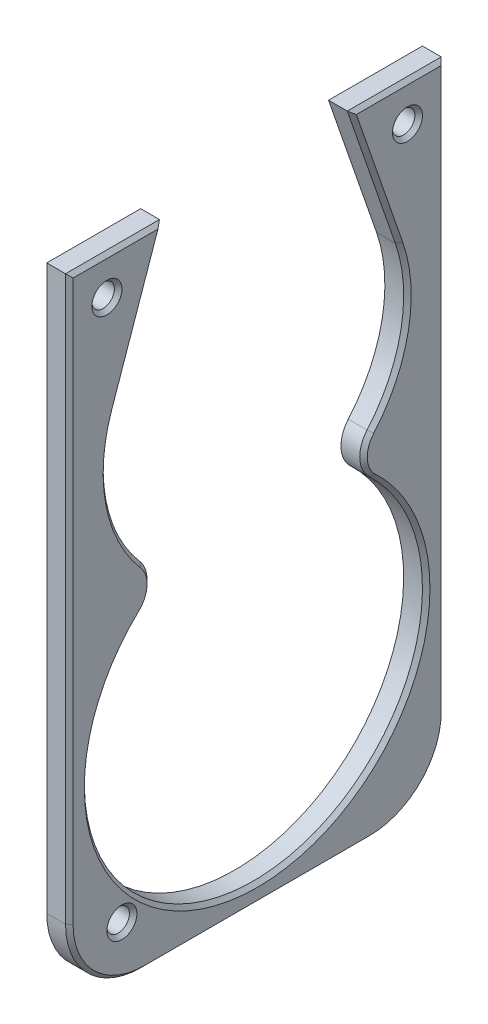
ISO-10303-21;
HEADER;
FILE_DESCRIPTION(('STEP AP214'),'2;1');
FILE_NAME('part.step','',(''),(''),'','','');
FILE_SCHEMA(('AUTOMOTIVE_DESIGN { 1 0 10303 214 1 1 1 1 }'));
ENDSEC;
DATA;
#1=APPLICATION_CONTEXT('core data for automotive mechanical design processes');
#2=APPLICATION_PROTOCOL_DEFINITION('international standard','automotive_design',2000,#1);
#3=PRODUCT_CONTEXT('',#1,'mechanical');
#4=PRODUCT('Part','Part','',(#3));
#5=PRODUCT_RELATED_PRODUCT_CATEGORY('part','',(#4));
#6=PRODUCT_DEFINITION_FORMATION('','',#4);
#7=PRODUCT_DEFINITION_CONTEXT('part definition',#1,'design');
#8=PRODUCT_DEFINITION('design','',#6,#7);
#9=PRODUCT_DEFINITION_SHAPE('','',#8);
#10=(LENGTH_UNIT() NAMED_UNIT(*) SI_UNIT(.MILLI.,.METRE.));
#11=(NAMED_UNIT(*) PLANE_ANGLE_UNIT() SI_UNIT($,.RADIAN.));
#12=(NAMED_UNIT(*) SI_UNIT($,.STERADIAN.) SOLID_ANGLE_UNIT());
#13=UNCERTAINTY_MEASURE_WITH_UNIT(LENGTH_MEASURE(1.E-05),#10,'distance_accuracy_value','');
#14=(GEOMETRIC_REPRESENTATION_CONTEXT(3) GLOBAL_UNCERTAINTY_ASSIGNED_CONTEXT((#13)) GLOBAL_UNIT_ASSIGNED_CONTEXT((#10,
#11,#12)) REPRESENTATION_CONTEXT('',''));
#15=CARTESIAN_POINT('',(0.,0.,0.));
#16=DIRECTION('',(0.,0.,1.));
#17=DIRECTION('',(1.,0.,0.));
#18=AXIS2_PLACEMENT_3D('',#15,#16,#17);
#19=CARTESIAN_POINT('',(0.,25.,0.));
#20=DIRECTION('',(1.,0.,0.));
#21=DIRECTION('',(0.,0.,-1.));
#22=AXIS2_PLACEMENT_3D('',#19,#20,#21);
#23=CYLINDRICAL_SURFACE('',#22,20.);
#24=DIRECTION('',(1.,0.,0.));
#25=VECTOR('',#24,1.);
#26=CARTESIAN_POINT('',(0.,11.9196428571429,-15.1295821824433));
#27=LINE('',#26,#25);
#28=CARTESIAN_POINT('',(0.,11.9196428571429,-15.1295821824433));
#29=VERTEX_POINT('',#28);
#30=CARTESIAN_POINT('',(2.49999999999998,11.9196428571429,-15.1295821824433));
#31=VERTEX_POINT('',#30);
#32=EDGE_CURVE('E369',#29,#31,#27,.T.);
#33=ORIENTED_EDGE('',*,*,#32,.T.);
#34=CARTESIAN_POINT('',(2.49999999999998,25.,0.));
#35=DIRECTION('',(1.,0.,0.));
#36=DIRECTION('',(0.,0.,-1.));
#37=AXIS2_PLACEMENT_3D('',#34,#35,#36);
#38=CIRCLE('',#37,20.);
#39=CARTESIAN_POINT('',(2.49999999999998,31.5518002592747,-18.8963994814506));
#40=VERTEX_POINT('',#39);
#41=EDGE_CURVE('E425',#31,#40,#38,.T.);
#42=ORIENTED_EDGE('',*,*,#41,.T.);
#43=DIRECTION('',(1.,0.,0.));
#44=VECTOR('',#43,1.);
#45=CARTESIAN_POINT('',(0.,31.5518002592747,-18.8963994814506));
#46=LINE('',#45,#44);
#47=CARTESIAN_POINT('',(0.,31.5518002592747,-18.8963994814506));
#48=VERTEX_POINT('',#47);
#49=EDGE_CURVE('E197',#48,#40,#46,.T.);
#50=ORIENTED_EDGE('',*,*,#49,.F.);
#51=CARTESIAN_POINT('',(0.,25.,0.));
#52=DIRECTION('',(1.,0.,0.));
#53=DIRECTION('',(0.,0.,-1.));
#54=AXIS2_PLACEMENT_3D('',#51,#52,#53);
#55=CIRCLE('',#54,20.);
#56=EDGE_CURVE('E207',#29,#48,#55,.T.);
#57=ORIENTED_EDGE('',*,*,#56,.F.);
#58=EDGE_LOOP('',(#33,#42,#50,#57));
#59=FACE_BOUND('',#58,.T.);
#60=ADVANCED_FACE('F46',(#59),#23,.F.);
#61=CARTESIAN_POINT('',(3.,50.,25.));
#62=DIRECTION('',(0.,-1.,0.));
#63=DIRECTION('',(0.,0.,-1.));
#64=AXIS2_PLACEMENT_3D('',#61,#62,#63);
#65=PLANE('',#64);
#66=DIRECTION('',(0.,0.,-1.));
#67=VECTOR('',#66,1.);
#68=CARTESIAN_POINT('',(2.49999999999999,50.,-25.));
#69=LINE('',#68,#67);
#70=CARTESIAN_POINT('',(2.49999999999999,50.,25.));
#71=VERTEX_POINT('',#70);
#72=CARTESIAN_POINT('',(2.49999999999999,50.,12.5));
#73=VERTEX_POINT('',#72);
#74=EDGE_CURVE('E327',#71,#73,#69,.T.);
#75=ORIENTED_EDGE('',*,*,#74,.T.);
#76=DIRECTION('',(1.,0.,0.));
#77=VECTOR('',#76,1.);
#78=CARTESIAN_POINT('',(0.,50.,12.5));
#79=LINE('',#78,#77);
#80=CARTESIAN_POINT('',(0.,50.,12.5));
#81=VERTEX_POINT('',#80);
#82=EDGE_CURVE('E225',#81,#73,#79,.T.);
#83=ORIENTED_EDGE('',*,*,#82,.F.);
#84=DIRECTION('',(0.,0.,1.));
#85=VECTOR('',#84,1.);
#86=CARTESIAN_POINT('',(0.,50.,25.));
#87=LINE('',#86,#85);
#88=CARTESIAN_POINT('',(0.,50.,25.));
#89=VERTEX_POINT('',#88);
#90=EDGE_CURVE('E213',#81,#89,#87,.T.);
#91=ORIENTED_EDGE('',*,*,#90,.T.);
#92=DIRECTION('',(-1.,0.,0.));
#93=VECTOR('',#92,1.);
#94=CARTESIAN_POINT('',(3.,50.,25.));
#95=LINE('',#94,#93);
#96=EDGE_CURVE('E265',#71,#89,#95,.T.);
#97=ORIENTED_EDGE('',*,*,#96,.F.);
#98=EDGE_LOOP('',(#75,#83,#91,#97));
#99=FACE_BOUND('',#98,.T.);
#100=ADVANCED_FACE('F484',(#99),#65,.F.);
#101=CARTESIAN_POINT('',(3.,49.5,0.));
#102=DIRECTION('',(0.707106781186535,0.70710678118656,0.));
#103=DIRECTION('',(0.,0.,-1.));
#104=AXIS2_PLACEMENT_3D('',#101,#102,#103);
#105=PLANE('',#104);
#106=DIRECTION('',(0.,0.,1.));
#107=VECTOR('',#106,1.);
#108=CARTESIAN_POINT('',(3.,49.5,25.));
#109=LINE('',#108,#107);
#110=CARTESIAN_POINT('',(3.,49.5,13.2025624189767));
#111=VERTEX_POINT('',#110);
#112=CARTESIAN_POINT('',(3.,49.5,24.5));
#113=VERTEX_POINT('',#112);
#114=EDGE_CURVE('E295',#111,#113,#109,.T.);
#115=ORIENTED_EDGE('',*,*,#114,.F.);
#116=DIRECTION('',(-0.501609247688936,0.501609247688919,-0.704823612874808));
#117=VECTOR('',#116,1.);
#118=CARTESIAN_POINT('',(-1.66771369022708,54.1677136902269,6.64384197638383));
#119=LINE('',#118,#117);
#120=EDGE_CURVE('E436',#111,#73,#119,.T.);
#121=ORIENTED_EDGE('',*,*,#120,.T.);
#122=ORIENTED_EDGE('',*,*,#74,.F.);
#123=DIRECTION('',(-0.577350269189638,0.577350269189618,0.577350269189621));
#124=VECTOR('',#123,1.);
#125=CARTESIAN_POINT('',(19.5000000000001,33.0000000000005,8.00000000000035));
#126=LINE('',#125,#124);
#127=EDGE_CURVE('E339',#71,#113,#126,.F.);
#128=ORIENTED_EDGE('',*,*,#127,.T.);
#129=EDGE_LOOP('',(#115,#121,#122,#128));
#130=FACE_BOUND('',#129,.T.);
#131=ADVANCED_FACE('F477',(#130),#105,.T.);
#132=CARTESIAN_POINT('',(3.,50.,25.));
#133=DIRECTION('',(0.,0.,-1.));
#134=DIRECTION('',(0.,1.,0.));
#135=AXIS2_PLACEMENT_3D('',#132,#133,#134);
#136=PLANE('',#135);
#137=DIRECTION('',(-1.,0.,0.));
#138=VECTOR('',#137,1.);
#139=CARTESIAN_POINT('',(3.,-25.,25.));
#140=LINE('',#139,#138);
#141=CARTESIAN_POINT('',(0.,-25.,25.));
#142=VERTEX_POINT('',#141);
#143=CARTESIAN_POINT('',(2.49999999999999,-25.,25.));
#144=VERTEX_POINT('',#143);
#145=EDGE_CURVE('E288',#142,#144,#140,.F.);
#146=ORIENTED_EDGE('',*,*,#145,.T.);
#147=DIRECTION('',(0.,1.,0.));
#148=VECTOR('',#147,1.);
#149=CARTESIAN_POINT('',(2.49999999999999,50.,25.));
#150=LINE('',#149,#148);
#151=EDGE_CURVE('E331',#144,#71,#150,.T.);
#152=ORIENTED_EDGE('',*,*,#151,.T.);
#153=ORIENTED_EDGE('',*,*,#96,.T.);
#154=DIRECTION('',(0.,-1.,0.));
#155=VECTOR('',#154,1.);
#156=CARTESIAN_POINT('',(0.,50.,25.));
#157=LINE('',#156,#155);
#158=EDGE_CURVE('E240',#89,#142,#157,.T.);
#159=ORIENTED_EDGE('',*,*,#158,.T.);
#160=EDGE_LOOP('',(#146,#152,#153,#159));
#161=FACE_BOUND('',#160,.T.);
#162=ADVANCED_FACE('F486',(#161),#136,.F.);
#163=CARTESIAN_POINT('',(3.,-35.,25.));
#164=DIRECTION('',(0.,1.,0.));
#165=DIRECTION('',(0.,0.,1.));
#166=AXIS2_PLACEMENT_3D('',#163,#164,#165);
#167=PLANE('',#166);
#168=DIRECTION('',(-1.,0.,0.));
#169=VECTOR('',#168,1.);
#170=CARTESIAN_POINT('',(3.,-35.,-15.));
#171=LINE('',#170,#169);
#172=CARTESIAN_POINT('',(0.,-35.,-15.));
#173=VERTEX_POINT('',#172);
#174=CARTESIAN_POINT('',(2.49999999999999,-35.,-15.));
#175=VERTEX_POINT('',#174);
#176=EDGE_CURVE('E284',#173,#175,#171,.F.);
#177=ORIENTED_EDGE('',*,*,#176,.T.);
#178=DIRECTION('',(0.,0.,1.));
#179=VECTOR('',#178,1.);
#180=CARTESIAN_POINT('',(2.49999999999999,-35.,15.));
#181=LINE('',#180,#179);
#182=CARTESIAN_POINT('',(2.49999999999999,-35.,15.));
#183=VERTEX_POINT('',#182);
#184=EDGE_CURVE('E320',#175,#183,#181,.T.);
#185=ORIENTED_EDGE('',*,*,#184,.T.);
#186=DIRECTION('',(-1.,0.,0.));
#187=VECTOR('',#186,1.);
#188=CARTESIAN_POINT('',(3.,-35.,15.));
#189=LINE('',#188,#187);
#190=CARTESIAN_POINT('',(0.,-35.,15.));
#191=VERTEX_POINT('',#190);
#192=EDGE_CURVE('E281',#183,#191,#189,.T.);
#193=ORIENTED_EDGE('',*,*,#192,.T.);
#194=DIRECTION('',(0.,0.,-1.));
#195=VECTOR('',#194,1.);
#196=CARTESIAN_POINT('',(0.,-35.,25.));
#197=LINE('',#196,#195);
#198=EDGE_CURVE('E253',#191,#173,#197,.T.);
#199=ORIENTED_EDGE('',*,*,#198,.T.);
#200=EDGE_LOOP('',(#177,#185,#193,#199));
#201=FACE_BOUND('',#200,.T.);
#202=ADVANCED_FACE('F621',(#201),#167,.F.);
#203=CARTESIAN_POINT('',(3.,50.,-25.));
#204=DIRECTION('',(0.,0.,1.));
#205=DIRECTION('',(0.,-1.,0.));
#206=AXIS2_PLACEMENT_3D('',#203,#204,#205);
#207=PLANE('',#206);
#208=DIRECTION('',(-1.,0.,0.));
#209=VECTOR('',#208,1.);
#210=CARTESIAN_POINT('',(3.,50.,-25.));
#211=LINE('',#210,#209);
#212=CARTESIAN_POINT('',(2.49999999999999,50.,-25.));
#213=VERTEX_POINT('',#212);
#214=CARTESIAN_POINT('',(0.,50.,-25.));
#215=VERTEX_POINT('',#214);
#216=EDGE_CURVE('E269',#213,#215,#211,.T.);
#217=ORIENTED_EDGE('',*,*,#216,.F.);
#218=DIRECTION('',(0.,-1.,0.));
#219=VECTOR('',#218,1.);
#220=CARTESIAN_POINT('',(2.49999999999999,-25.,-25.));
#221=LINE('',#220,#219);
#222=CARTESIAN_POINT('',(2.49999999999999,-25.,-25.));
#223=VERTEX_POINT('',#222);
#224=EDGE_CURVE('E313',#213,#223,#221,.T.);
#225=ORIENTED_EDGE('',*,*,#224,.T.);
#226=DIRECTION('',(-1.,0.,0.));
#227=VECTOR('',#226,1.);
#228=CARTESIAN_POINT('',(3.,-25.,-25.));
#229=LINE('',#228,#227);
#230=CARTESIAN_POINT('',(0.,-25.,-25.));
#231=VERTEX_POINT('',#230);
#232=EDGE_CURVE('E272',#223,#231,#229,.T.);
#233=ORIENTED_EDGE('',*,*,#232,.T.);
#234=DIRECTION('',(0.,1.,0.));
#235=VECTOR('',#234,1.);
#236=CARTESIAN_POINT('',(0.,50.,-25.));
#237=LINE('',#236,#235);
#238=EDGE_CURVE('E257',#231,#215,#237,.T.);
#239=ORIENTED_EDGE('',*,*,#238,.T.);
#240=EDGE_LOOP('',(#217,#225,#233,#239));
#241=FACE_BOUND('',#240,.T.);
#242=ADVANCED_FACE('F618',(#241),#207,.F.);
#243=CARTESIAN_POINT('',(0.,50.,-12.5));
#244=VERTEX_POINT('',#243);
#245=EDGE_CURVE('E261',#215,#244,#87,.T.);
#246=ORIENTED_EDGE('',*,*,#245,.T.);
#247=DIRECTION('',(1.,0.,0.));
#248=VECTOR('',#247,1.);
#249=CARTESIAN_POINT('',(0.,50.,-12.5));
#250=LINE('',#249,#248);
#251=CARTESIAN_POINT('',(2.49999999999999,50.,-12.5));
#252=VERTEX_POINT('',#251);
#253=EDGE_CURVE('E229',#244,#252,#250,.T.);
#254=ORIENTED_EDGE('',*,*,#253,.T.);
#255=EDGE_CURVE('E326',#252,#213,#69,.T.);
#256=ORIENTED_EDGE('',*,*,#255,.T.);
#257=ORIENTED_EDGE('',*,*,#216,.T.);
#258=EDGE_LOOP('',(#246,#254,#256,#257));
#259=FACE_BOUND('',#258,.T.);
#260=ADVANCED_FACE('F531',(#259),#65,.F.);
#261=CARTESIAN_POINT('',(3.,0.,0.));
#262=DIRECTION('',(1.,0.,0.));
#263=DIRECTION('',(0.,0.,-1.));
#264=AXIS2_PLACEMENT_3D('',#261,#262,#263);
#265=PLANE('',#264);
#266=CARTESIAN_POINT('',(3.,49.5,-24.5));
#267=VERTEX_POINT('',#266);
#268=CARTESIAN_POINT('',(3.,49.5,-13.2025624189767));
#269=VERTEX_POINT('',#268);
#270=EDGE_CURVE('E296',#267,#269,#109,.T.);
#271=ORIENTED_EDGE('',*,*,#270,.T.);
#272=DIRECTION('',(0.,-0.944819974072532,-0.327590012963734));
#273=VECTOR('',#272,1.);
#274=CARTESIAN_POINT('',(3.,31.7155952657566,-19.3688094684869));
#275=LINE('',#274,#273);
#276=CARTESIAN_POINT('',(3.,31.7155952657566,-19.3688094684869));
#277=VERTEX_POINT('',#276);
#278=EDGE_CURVE('E422',#269,#277,#275,.T.);
#279=ORIENTED_EDGE('',*,*,#278,.T.);
#280=CARTESIAN_POINT('',(3.,25.,0.));
#281=DIRECTION('',(1.,0.,0.));
#282=DIRECTION('',(0.,0.,-1.));
#283=AXIS2_PLACEMENT_3D('',#280,#281,#282);
#284=CIRCLE('',#283,20.5);
#285=CARTESIAN_POINT('',(3.,11.5926339285714,-15.5078217370044));
#286=VERTEX_POINT('',#285);
#287=EDGE_CURVE('E419',#277,#286,#284,.F.);
#288=ORIENTED_EDGE('',*,*,#287,.T.);
#289=CARTESIAN_POINT('',(3.,9.30357142857143,-18.155498618932));
#290=DIRECTION('',(1.,0.,0.));
#291=DIRECTION('',(0.,0.,-1.));
#292=AXIS2_PLACEMENT_3D('',#289,#290,#291);
#293=CIRCLE('',#292,3.49999999999997);
#294=CARTESIAN_POINT('',(3.,6.75404312668466,-15.7576025749221));
#295=VERTEX_POINT('',#294);
#296=EDGE_CURVE('E416',#286,#295,#293,.T.);
#297=ORIENTED_EDGE('',*,*,#296,.T.);
#298=CARTESIAN_POINT('',(3.,-10.,0.));
#299=DIRECTION('',(1.,0.,0.));
#300=DIRECTION('',(0.,0.,-1.));
#301=AXIS2_PLACEMENT_3D('',#298,#299,#300);
#302=CIRCLE('',#301,23.);
#303=CARTESIAN_POINT('',(3.,6.75404312668465,15.7576025749221));
#304=VERTEX_POINT('',#303);
#305=EDGE_CURVE('E413',#295,#304,#302,.F.);
#306=ORIENTED_EDGE('',*,*,#305,.T.);
#307=CARTESIAN_POINT('',(3.,9.30357142857142,18.155498618932));
#308=DIRECTION('',(1.,0.,0.));
#309=DIRECTION('',(0.,0.,-1.));
#310=AXIS2_PLACEMENT_3D('',#307,#308,#309);
#311=CIRCLE('',#310,3.49999999999997);
#312=CARTESIAN_POINT('',(3.,11.5926339285714,15.5078217370044));
#313=VERTEX_POINT('',#312);
#314=EDGE_CURVE('E407',#304,#313,#311,.T.);
#315=ORIENTED_EDGE('',*,*,#314,.T.);
#316=CARTESIAN_POINT('',(3.,25.,0.));
#317=DIRECTION('',(1.,0.,0.));
#318=DIRECTION('',(0.,0.,-1.));
#319=AXIS2_PLACEMENT_3D('',#316,#317,#318);
#320=CIRCLE('',#319,20.5);
#321=CARTESIAN_POINT('',(3.,31.7155952657565,19.3688094684869));
#322=VERTEX_POINT('',#321);
#323=EDGE_CURVE('E404',#313,#322,#320,.F.);
#324=ORIENTED_EDGE('',*,*,#323,.T.);
#325=DIRECTION('',(0.,0.944819974072532,-0.327590012963734));
#326=VECTOR('',#325,1.);
#327=CARTESIAN_POINT('',(3.,49.6637950064819,13.145771062137));
#328=LINE('',#327,#326);
#329=EDGE_CURVE('E410',#322,#111,#328,.T.);
#330=ORIENTED_EDGE('',*,*,#329,.T.);
#331=ORIENTED_EDGE('',*,*,#114,.T.);
#332=DIRECTION('',(0.,-1.,0.));
#333=VECTOR('',#332,1.);
#334=CARTESIAN_POINT('',(3.,-25.,24.5));
#335=LINE('',#334,#333);
#336=CARTESIAN_POINT('',(3.,-25.,24.5));
#337=VERTEX_POINT('',#336);
#338=EDGE_CURVE('E292',#113,#337,#335,.T.);
#339=ORIENTED_EDGE('',*,*,#338,.T.);
#340=CARTESIAN_POINT('',(3.,-25.,15.));
#341=DIRECTION('',(1.,0.,0.));
#342=DIRECTION('',(0.,0.,-1.));
#343=AXIS2_PLACEMENT_3D('',#340,#341,#342);
#344=CIRCLE('',#343,9.5);
#345=CARTESIAN_POINT('',(3.,-34.5,15.));
#346=VERTEX_POINT('',#345);
#347=EDGE_CURVE('E300',#337,#346,#344,.T.);
#348=ORIENTED_EDGE('',*,*,#347,.T.);
#349=DIRECTION('',(0.,0.,-1.));
#350=VECTOR('',#349,1.);
#351=CARTESIAN_POINT('',(3.,-34.5,-15.));
#352=LINE('',#351,#350);
#353=CARTESIAN_POINT('',(3.,-34.5,-15.));
#354=VERTEX_POINT('',#353);
#355=EDGE_CURVE('E303',#346,#354,#352,.T.);
#356=ORIENTED_EDGE('',*,*,#355,.T.);
#357=CARTESIAN_POINT('',(3.,-25.,-15.));
#358=DIRECTION('',(1.,0.,0.));
#359=DIRECTION('',(0.,0.,-1.));
#360=AXIS2_PLACEMENT_3D('',#357,#358,#359);
#361=CIRCLE('',#360,9.5);
#362=CARTESIAN_POINT('',(3.,-25.,-24.5));
#363=VERTEX_POINT('',#362);
#364=EDGE_CURVE('E306',#354,#363,#361,.T.);
#365=ORIENTED_EDGE('',*,*,#364,.T.);
#366=DIRECTION('',(0.,1.,0.));
#367=VECTOR('',#366,1.);
#368=CARTESIAN_POINT('',(3.,50.,-24.5));
#369=LINE('',#368,#367);
#370=EDGE_CURVE('E309',#363,#267,#369,.T.);
#371=ORIENTED_EDGE('',*,*,#370,.T.);
#372=EDGE_LOOP('',(#271,#279,#288,#297,#306,#315,#324,#330,#331,#339,#348,#356,#365,#371));
#373=FACE_BOUND('',#372,.T.);
#374=CARTESIAN_POINT('',(3.,-28.,18.));
#375=DIRECTION('',(1.,0.,0.));
#376=DIRECTION('',(0.,0.,-1.));
#377=AXIS2_PLACEMENT_3D('',#374,#375,#376);
#378=CIRCLE('',#377,1.99999999999999);
#379=CARTESIAN_POINT('',(3.,-28.,16.));
#380=VERTEX_POINT('',#379);
#381=EDGE_CURVE('E385',#380,#380,#378,.F.);
#382=ORIENTED_EDGE('',*,*,#381,.T.);
#383=EDGE_LOOP('',(#382));
#384=FACE_BOUND('',#383,.T.);
#385=CARTESIAN_POINT('',(3.,45.,-20.));
#386=DIRECTION('',(1.,0.,0.));
#387=DIRECTION('',(0.,0.,-1.));
#388=AXIS2_PLACEMENT_3D('',#385,#386,#387);
#389=CIRCLE('',#388,1.99999999999999);
#390=CARTESIAN_POINT('',(3.,45.,-22.));
#391=VERTEX_POINT('',#390);
#392=EDGE_CURVE('E381',#391,#391,#389,.F.);
#393=ORIENTED_EDGE('',*,*,#392,.T.);
#394=EDGE_LOOP('',(#393));
#395=FACE_BOUND('',#394,.T.);
#396=CARTESIAN_POINT('',(3.,45.,20.));
#397=DIRECTION('',(1.,0.,0.));
#398=DIRECTION('',(0.,0.,-1.));
#399=AXIS2_PLACEMENT_3D('',#396,#397,#398);
#400=CIRCLE('',#399,1.99999999999999);
#401=CARTESIAN_POINT('',(3.,45.,18.));
#402=VERTEX_POINT('',#401);
#403=EDGE_CURVE('E377',#402,#402,#400,.F.);
#404=ORIENTED_EDGE('',*,*,#403,.T.);
#405=EDGE_LOOP('',(#404));
#406=FACE_BOUND('',#405,.T.);
#407=ADVANCED_FACE('F473',(#373,#384,#395,#406),#265,.T.);
#408=CARTESIAN_POINT('',(0.,0.,0.));
#409=DIRECTION('',(1.,0.,0.));
#410=DIRECTION('',(0.,0.,-1.));
#411=AXIS2_PLACEMENT_3D('',#408,#409,#410);
#412=PLANE('',#411);
#413=CARTESIAN_POINT('',(0.,31.5518002592747,18.8963994814507));
#414=VERTEX_POINT('',#413);
#415=CARTESIAN_POINT('',(0.,11.9196428571429,15.1295821824433));
#416=VERTEX_POINT('',#415);
#417=EDGE_CURVE('E201',#414,#416,#55,.T.);
#418=ORIENTED_EDGE('',*,*,#417,.T.);
#419=CARTESIAN_POINT('',(0.,9.30357142857142,18.155498618932));
#420=DIRECTION('',(1.,0.,0.));
#421=DIRECTION('',(0.,0.,-1.));
#422=AXIS2_PLACEMENT_3D('',#419,#420,#421);
#423=CIRCLE('',#422,4.);
#424=CARTESIAN_POINT('',(0.,6.38982479784366,15.4150459972064));
#425=VERTEX_POINT('',#424);
#426=EDGE_CURVE('E359',#416,#425,#423,.F.);
#427=ORIENTED_EDGE('',*,*,#426,.T.);
#428=CARTESIAN_POINT('',(0.,-10.,0.));
#429=DIRECTION('',(1.,0.,0.));
#430=DIRECTION('',(0.,0.,-1.));
#431=AXIS2_PLACEMENT_3D('',#428,#429,#430);
#432=CIRCLE('',#431,22.5);
#433=CARTESIAN_POINT('',(0.,6.38982479784367,-15.4150459972064));
#434=VERTEX_POINT('',#433);
#435=EDGE_CURVE('E215',#425,#434,#432,.T.);
#436=ORIENTED_EDGE('',*,*,#435,.T.);
#437=CARTESIAN_POINT('',(0.,9.30357142857143,-18.155498618932));
#438=DIRECTION('',(1.,0.,0.));
#439=DIRECTION('',(0.,0.,-1.));
#440=AXIS2_PLACEMENT_3D('',#437,#438,#439);
#441=CIRCLE('',#440,4.);
#442=EDGE_CURVE('E356',#434,#29,#441,.F.);
#443=ORIENTED_EDGE('',*,*,#442,.T.);
#444=ORIENTED_EDGE('',*,*,#56,.T.);
#445=DIRECTION('',(0.,0.944819974072532,0.327590012963734));
#446=VECTOR('',#445,1.);
#447=CARTESIAN_POINT('',(0.,31.5518002592747,-18.8963994814506));
#448=LINE('',#447,#446);
#449=EDGE_CURVE('E198',#48,#244,#448,.T.);
#450=ORIENTED_EDGE('',*,*,#449,.T.);
#451=ORIENTED_EDGE('',*,*,#245,.F.);
#452=ORIENTED_EDGE('',*,*,#238,.F.);
#453=CARTESIAN_POINT('',(0.,-25.,-15.));
#454=DIRECTION('',(1.,0.,0.));
#455=DIRECTION('',(0.,0.,-1.));
#456=AXIS2_PLACEMENT_3D('',#453,#454,#455);
#457=CIRCLE('',#456,10.);
#458=EDGE_CURVE('E278',#231,#173,#457,.F.);
#459=ORIENTED_EDGE('',*,*,#458,.T.);
#460=ORIENTED_EDGE('',*,*,#198,.F.);
#461=CARTESIAN_POINT('',(0.,-25.,15.));
#462=DIRECTION('',(1.,0.,0.));
#463=DIRECTION('',(0.,0.,-1.));
#464=AXIS2_PLACEMENT_3D('',#461,#462,#463);
#465=CIRCLE('',#464,10.);
#466=EDGE_CURVE('E275',#191,#142,#465,.F.);
#467=ORIENTED_EDGE('',*,*,#466,.T.);
#468=ORIENTED_EDGE('',*,*,#158,.F.);
#469=ORIENTED_EDGE('',*,*,#90,.F.);
#470=DIRECTION('',(0.,-0.944819974072532,0.327590012963734));
#471=VECTOR('',#470,1.);
#472=CARTESIAN_POINT('',(0.,50.,12.5));
#473=LINE('',#472,#471);
#474=EDGE_CURVE('E193',#81,#414,#473,.T.);
#475=ORIENTED_EDGE('',*,*,#474,.T.);
#476=EDGE_LOOP('',(#418,#427,#436,#443,#444,#450,#451,#452,#459,#460,#467,#468,#469,#475));
#477=FACE_BOUND('',#476,.T.);
#478=CARTESIAN_POINT('',(0.,45.,-20.));
#479=DIRECTION('',(1.,0.,0.));
#480=DIRECTION('',(0.,0.,-1.));
#481=AXIS2_PLACEMENT_3D('',#478,#479,#480);
#482=CIRCLE('',#481,1.5);
#483=CARTESIAN_POINT('',(0.,45.,-21.5));
#484=VERTEX_POINT('',#483);
#485=EDGE_CURVE('E236',#484,#484,#482,.T.);
#486=ORIENTED_EDGE('',*,*,#485,.T.);
#487=EDGE_LOOP('',(#486));
#488=FACE_BOUND('',#487,.T.);
#489=CARTESIAN_POINT('',(0.,45.,20.));
#490=DIRECTION('',(1.,0.,0.));
#491=DIRECTION('',(0.,0.,-1.));
#492=AXIS2_PLACEMENT_3D('',#489,#490,#491);
#493=CIRCLE('',#492,1.5);
#494=CARTESIAN_POINT('',(0.,45.,18.5));
#495=VERTEX_POINT('',#494);
#496=EDGE_CURVE('E241',#495,#495,#493,.T.);
#497=ORIENTED_EDGE('',*,*,#496,.T.);
#498=EDGE_LOOP('',(#497));
#499=FACE_BOUND('',#498,.T.);
#500=CARTESIAN_POINT('',(0.,-28.,18.));
#501=DIRECTION('',(1.,0.,0.));
#502=DIRECTION('',(0.,0.,-1.));
#503=AXIS2_PLACEMENT_3D('',#500,#501,#502);
#504=CIRCLE('',#503,1.5);
#505=CARTESIAN_POINT('',(0.,-28.,16.5));
#506=VERTEX_POINT('',#505);
#507=EDGE_CURVE('E245',#506,#506,#504,.T.);
#508=ORIENTED_EDGE('',*,*,#507,.T.);
#509=EDGE_LOOP('',(#508));
#510=FACE_BOUND('',#509,.T.);
#511=ADVANCED_FACE('F210',(#477,#488,#499,#510),#412,.F.);
#512=CARTESIAN_POINT('',(3.,-25.,-15.));
#513=DIRECTION('',(-1.,0.,0.));
#514=DIRECTION('',(0.,0.,1.));
#515=AXIS2_PLACEMENT_3D('',#512,#513,#514);
#516=CYLINDRICAL_SURFACE('',#515,10.);
#517=ORIENTED_EDGE('',*,*,#232,.F.);
#518=CARTESIAN_POINT('',(2.49999999999999,-25.,-15.));
#519=DIRECTION('',(1.,0.,0.));
#520=DIRECTION('',(0.,0.,-1.));
#521=AXIS2_PLACEMENT_3D('',#518,#519,#520);
#522=CIRCLE('',#521,10.);
#523=EDGE_CURVE('E317',#223,#175,#522,.F.);
#524=ORIENTED_EDGE('',*,*,#523,.T.);
#525=ORIENTED_EDGE('',*,*,#176,.F.);
#526=ORIENTED_EDGE('',*,*,#458,.F.);
#527=EDGE_LOOP('',(#517,#524,#525,#526));
#528=FACE_BOUND('',#527,.T.);
#529=ADVANCED_FACE('F615',(#528),#516,.T.);
#530=CARTESIAN_POINT('',(3.,-25.,15.));
#531=DIRECTION('',(-1.,0.,0.));
#532=DIRECTION('',(0.,0.,1.));
#533=AXIS2_PLACEMENT_3D('',#530,#531,#532);
#534=CYLINDRICAL_SURFACE('',#533,10.);
#535=ORIENTED_EDGE('',*,*,#192,.F.);
#536=CARTESIAN_POINT('',(2.49999999999999,-25.,15.));
#537=DIRECTION('',(1.,0.,0.));
#538=DIRECTION('',(0.,0.,-1.));
#539=AXIS2_PLACEMENT_3D('',#536,#537,#538);
#540=CIRCLE('',#539,10.);
#541=EDGE_CURVE('E323',#183,#144,#540,.F.);
#542=ORIENTED_EDGE('',*,*,#541,.T.);
#543=ORIENTED_EDGE('',*,*,#145,.F.);
#544=ORIENTED_EDGE('',*,*,#466,.F.);
#545=EDGE_LOOP('',(#535,#542,#543,#544));
#546=FACE_BOUND('',#545,.T.);
#547=ADVANCED_FACE('F493',(#546),#534,.T.);
#548=CARTESIAN_POINT('',(0.,-28.,18.));
#549=DIRECTION('',(1.,0.,0.));
#550=DIRECTION('',(0.,0.,-1.));
#551=AXIS2_PLACEMENT_3D('',#548,#549,#550);
#552=CYLINDRICAL_SURFACE('',#551,1.5);
#553=CARTESIAN_POINT('',(2.50000000000002,-28.,18.));
#554=DIRECTION('',(1.,0.,0.));
#555=DIRECTION('',(0.,0.,-1.));
#556=AXIS2_PLACEMENT_3D('',#553,#554,#555);
#557=CIRCLE('',#556,1.5);
#558=CARTESIAN_POINT('',(2.50000000000002,-28.,16.5));
#559=VERTEX_POINT('',#558);
#560=EDGE_CURVE('E373',#559,#559,#557,.T.);
#561=ORIENTED_EDGE('',*,*,#560,.T.);
#562=EDGE_LOOP('',(#561));
#563=FACE_BOUND('',#562,.T.);
#564=ORIENTED_EDGE('',*,*,#507,.F.);
#565=EDGE_LOOP('',(#564));
#566=FACE_BOUND('',#565,.T.);
#567=ADVANCED_FACE('F607',(#563,#566),#552,.F.);
#568=CARTESIAN_POINT('',(0.,45.,20.));
#569=DIRECTION('',(1.,0.,0.));
#570=DIRECTION('',(0.,0.,-1.));
#571=AXIS2_PLACEMENT_3D('',#568,#569,#570);
#572=CYLINDRICAL_SURFACE('',#571,1.5);
#573=CARTESIAN_POINT('',(2.50000000000002,45.,20.));
#574=DIRECTION('',(1.,0.,0.));
#575=DIRECTION('',(0.,0.,-1.));
#576=AXIS2_PLACEMENT_3D('',#573,#574,#575);
#577=CIRCLE('',#576,1.5);
#578=CARTESIAN_POINT('',(2.50000000000002,45.,18.5));
#579=VERTEX_POINT('',#578);
#580=EDGE_CURVE('E393',#579,#579,#577,.T.);
#581=ORIENTED_EDGE('',*,*,#580,.T.);
#582=EDGE_LOOP('',(#581));
#583=FACE_BOUND('',#582,.T.);
#584=ORIENTED_EDGE('',*,*,#496,.F.);
#585=EDGE_LOOP('',(#584));
#586=FACE_BOUND('',#585,.T.);
#587=ADVANCED_FACE('F603',(#583,#586),#572,.F.);
#588=CARTESIAN_POINT('',(0.,45.,-20.));
#589=DIRECTION('',(1.,0.,0.));
#590=DIRECTION('',(0.,0.,-1.));
#591=AXIS2_PLACEMENT_3D('',#588,#589,#590);
#592=CYLINDRICAL_SURFACE('',#591,1.5);
#593=CARTESIAN_POINT('',(2.50000000000002,45.,-20.));
#594=DIRECTION('',(1.,0.,0.));
#595=DIRECTION('',(0.,0.,-1.));
#596=AXIS2_PLACEMENT_3D('',#593,#594,#595);
#597=CIRCLE('',#596,1.5);
#598=CARTESIAN_POINT('',(2.50000000000002,45.,-21.5));
#599=VERTEX_POINT('',#598);
#600=EDGE_CURVE('E389',#599,#599,#597,.T.);
#601=ORIENTED_EDGE('',*,*,#600,.T.);
#602=EDGE_LOOP('',(#601));
#603=FACE_BOUND('',#602,.T.);
#604=ORIENTED_EDGE('',*,*,#485,.F.);
#605=EDGE_LOOP('',(#604));
#606=FACE_BOUND('',#605,.T.);
#607=ADVANCED_FACE('F600',(#603,#606),#592,.F.);
#608=CARTESIAN_POINT('',(3.,-25.,15.));
#609=DIRECTION('',(-1.,0.,0.));
#610=DIRECTION('',(0.,0.,1.));
#611=AXIS2_PLACEMENT_3D('',#608,#609,#610);
#612=CONICAL_SURFACE('',#611,9.5,0.785398163397435);
#613=DIRECTION('',(0.707106781186557,0.,-0.707106781186538));
#614=VECTOR('',#613,1.);
#615=CARTESIAN_POINT('',(2.49999999999999,-25.,25.));
#616=LINE('',#615,#614);
#617=EDGE_CURVE('E347',#144,#337,#616,.T.);
#618=ORIENTED_EDGE('',*,*,#617,.F.);
#619=ORIENTED_EDGE('',*,*,#541,.F.);
#620=DIRECTION('',(-0.707106781186557,-0.707106781186538,0.));
#621=VECTOR('',#620,1.);
#622=CARTESIAN_POINT('',(3.,-34.5,15.));
#623=LINE('',#622,#621);
#624=EDGE_CURVE('E249',#346,#183,#623,.T.);
#625=ORIENTED_EDGE('',*,*,#624,.F.);
#626=ORIENTED_EDGE('',*,*,#347,.F.);
#627=EDGE_LOOP('',(#618,#619,#625,#626));
#628=FACE_BOUND('',#627,.T.);
#629=ADVANCED_FACE('F498',(#628),#612,.T.);
#630=CARTESIAN_POINT('',(3.,-34.5,0.));
#631=DIRECTION('',(0.707106781186538,-0.707106781186557,0.));
#632=DIRECTION('',(0.,0.,1.));
#633=AXIS2_PLACEMENT_3D('',#630,#631,#632);
#634=PLANE('',#633);
#635=ORIENTED_EDGE('',*,*,#624,.T.);
#636=ORIENTED_EDGE('',*,*,#184,.F.);
#637=DIRECTION('',(-0.707106781186557,-0.707106781186538,0.));
#638=VECTOR('',#637,1.);
#639=CARTESIAN_POINT('',(3.,-34.5,-15.));
#640=LINE('',#639,#638);
#641=EDGE_CURVE('E343',#354,#175,#640,.T.);
#642=ORIENTED_EDGE('',*,*,#641,.F.);
#643=ORIENTED_EDGE('',*,*,#355,.F.);
#644=EDGE_LOOP('',(#635,#636,#642,#643));
#645=FACE_BOUND('',#644,.T.);
#646=ADVANCED_FACE('F506',(#645),#634,.T.);
#647=CARTESIAN_POINT('',(3.,0.,24.5));
#648=DIRECTION('',(0.707106781186537,0.,0.707106781186558));
#649=DIRECTION('',(0.,1.,0.));
#650=AXIS2_PLACEMENT_3D('',#647,#648,#649);
#651=PLANE('',#650);
#652=ORIENTED_EDGE('',*,*,#617,.T.);
#653=ORIENTED_EDGE('',*,*,#338,.F.);
#654=ORIENTED_EDGE('',*,*,#127,.F.);
#655=ORIENTED_EDGE('',*,*,#151,.F.);
#656=EDGE_LOOP('',(#652,#653,#654,#655));
#657=FACE_BOUND('',#656,.T.);
#658=ADVANCED_FACE('F501',(#657),#651,.T.);
#659=CARTESIAN_POINT('',(3.,-25.,-15.));
#660=DIRECTION('',(-1.,0.,0.));
#661=DIRECTION('',(0.,0.,1.));
#662=AXIS2_PLACEMENT_3D('',#659,#660,#661);
#663=CONICAL_SURFACE('',#662,9.5,0.785398163397433);
#664=ORIENTED_EDGE('',*,*,#641,.T.);
#665=ORIENTED_EDGE('',*,*,#523,.F.);
#666=DIRECTION('',(-0.707106781186557,0.,-0.707106781186538));
#667=VECTOR('',#666,1.);
#668=CARTESIAN_POINT('',(3.,-25.,-24.5));
#669=LINE('',#668,#667);
#670=EDGE_CURVE('E336',#363,#223,#669,.T.);
#671=ORIENTED_EDGE('',*,*,#670,.F.);
#672=ORIENTED_EDGE('',*,*,#364,.F.);
#673=EDGE_LOOP('',(#664,#665,#671,#672));
#674=FACE_BOUND('',#673,.T.);
#675=ADVANCED_FACE('F511',(#674),#663,.T.);
#676=ORIENTED_EDGE('',*,*,#255,.F.);
#677=DIRECTION('',(0.501609247688936,-0.501609247688918,-0.704823612874808));
#678=VECTOR('',#677,1.);
#679=CARTESIAN_POINT('',(-1.66771369022708,54.1677136902269,-6.64384197638381));
#680=LINE('',#679,#678);
#681=EDGE_CURVE('E401',#252,#269,#680,.T.);
#682=ORIENTED_EDGE('',*,*,#681,.T.);
#683=ORIENTED_EDGE('',*,*,#270,.F.);
#684=DIRECTION('',(-0.577350269189638,0.577350269189618,-0.577350269189621));
#685=VECTOR('',#684,1.);
#686=CARTESIAN_POINT('',(11.1666666666668,41.3333333333335,-16.3333333333335));
#687=LINE('',#686,#685);
#688=EDGE_CURVE('E228',#213,#267,#687,.F.);
#689=ORIENTED_EDGE('',*,*,#688,.F.);
#690=EDGE_LOOP('',(#676,#682,#683,#689));
#691=FACE_BOUND('',#690,.T.);
#692=ADVANCED_FACE('F521',(#691),#105,.T.);
#693=CARTESIAN_POINT('',(3.,0.,-24.5));
#694=DIRECTION('',(0.707106781186537,0.,-0.707106781186558));
#695=DIRECTION('',(0.,-1.,0.));
#696=AXIS2_PLACEMENT_3D('',#693,#694,#695);
#697=PLANE('',#696);
#698=ORIENTED_EDGE('',*,*,#670,.T.);
#699=ORIENTED_EDGE('',*,*,#224,.F.);
#700=ORIENTED_EDGE('',*,*,#688,.T.);
#701=ORIENTED_EDGE('',*,*,#370,.F.);
#702=EDGE_LOOP('',(#698,#699,#700,#701));
#703=FACE_BOUND('',#702,.T.);
#704=ADVANCED_FACE('F516',(#703),#697,.T.);
#705=CARTESIAN_POINT('',(0.,50.,12.5));
#706=DIRECTION('',(0.,0.327590012963734,0.944819974072532));
#707=DIRECTION('',(0.,-0.944819974072532,0.327590012963734));
#708=AXIS2_PLACEMENT_3D('',#705,#706,#707);
#709=PLANE('',#708);
#710=ORIENTED_EDGE('',*,*,#82,.T.);
#711=DIRECTION('',(0.,-0.944819974072532,0.327590012963734));
#712=VECTOR('',#711,1.);
#713=CARTESIAN_POINT('',(2.49999999999998,31.5518002592747,18.8963994814507));
#714=LINE('',#713,#712);
#715=CARTESIAN_POINT('',(2.49999999999998,31.5518002592747,18.8963994814507));
#716=VERTEX_POINT('',#715);
#717=EDGE_CURVE('E71',#73,#716,#714,.T.);
#718=ORIENTED_EDGE('',*,*,#717,.T.);
#719=DIRECTION('',(1.,0.,0.));
#720=VECTOR('',#719,1.);
#721=CARTESIAN_POINT('',(0.,31.5518002592747,18.8963994814507));
#722=LINE('',#721,#720);
#723=EDGE_CURVE('E189',#414,#716,#722,.T.);
#724=ORIENTED_EDGE('',*,*,#723,.F.);
#725=ORIENTED_EDGE('',*,*,#474,.F.);
#726=EDGE_LOOP('',(#710,#718,#724,#725));
#727=FACE_BOUND('',#726,.T.);
#728=ADVANCED_FACE('F191',(#727),#709,.F.);
#729=CARTESIAN_POINT('',(0.,31.5518002592747,-18.8963994814506));
#730=DIRECTION('',(0.,0.327590012963734,-0.944819974072532));
#731=DIRECTION('',(0.,0.944819974072532,0.327590012963734));
#732=AXIS2_PLACEMENT_3D('',#729,#730,#731);
#733=PLANE('',#732);
#734=ORIENTED_EDGE('',*,*,#49,.T.);
#735=DIRECTION('',(0.,0.944819974072532,0.327590012963734));
#736=VECTOR('',#735,1.);
#737=CARTESIAN_POINT('',(2.49999999999998,49.5,-12.6733610751007));
#738=LINE('',#737,#736);
#739=EDGE_CURVE('E397',#40,#252,#738,.T.);
#740=ORIENTED_EDGE('',*,*,#739,.T.);
#741=ORIENTED_EDGE('',*,*,#253,.F.);
#742=ORIENTED_EDGE('',*,*,#449,.F.);
#743=EDGE_LOOP('',(#734,#740,#741,#742));
#744=FACE_BOUND('',#743,.T.);
#745=ADVANCED_FACE('F526',(#744),#733,.F.);
#746=ORIENTED_EDGE('',*,*,#723,.T.);
#747=CARTESIAN_POINT('',(2.49999999999998,25.,0.));
#748=DIRECTION('',(1.,0.,0.));
#749=DIRECTION('',(0.,0.,-1.));
#750=AXIS2_PLACEMENT_3D('',#747,#748,#749);
#751=CIRCLE('',#750,20.);
#752=CARTESIAN_POINT('',(2.49999999999998,11.9196428571429,15.1295821824433));
#753=VERTEX_POINT('',#752);
#754=EDGE_CURVE('E11',#716,#753,#751,.T.);
#755=ORIENTED_EDGE('',*,*,#754,.T.);
#756=DIRECTION('',(1.,0.,0.));
#757=VECTOR('',#756,1.);
#758=CARTESIAN_POINT('',(0.,11.9196428571429,15.1295821824433));
#759=LINE('',#758,#757);
#760=EDGE_CURVE('E203',#753,#416,#759,.F.);
#761=ORIENTED_EDGE('',*,*,#760,.T.);
#762=ORIENTED_EDGE('',*,*,#417,.F.);
#763=EDGE_LOOP('',(#746,#755,#761,#762));
#764=FACE_BOUND('',#763,.T.);
#765=ADVANCED_FACE('F202',(#764),#23,.F.);
#766=CARTESIAN_POINT('',(0.,-10.,0.));
#767=DIRECTION('',(1.,0.,0.));
#768=DIRECTION('',(0.,0.,-1.));
#769=AXIS2_PLACEMENT_3D('',#766,#767,#768);
#770=CYLINDRICAL_SURFACE('',#769,22.5);
#771=DIRECTION('',(1.,0.,0.));
#772=VECTOR('',#771,1.);
#773=CARTESIAN_POINT('',(0.,6.38982479784366,15.4150459972064));
#774=LINE('',#773,#772);
#775=CARTESIAN_POINT('',(2.49999999999998,6.38982479784366,15.4150459972064));
#776=VERTEX_POINT('',#775);
#777=EDGE_CURVE('E365',#425,#776,#774,.T.);
#778=ORIENTED_EDGE('',*,*,#777,.T.);
#779=CARTESIAN_POINT('',(2.49999999999998,-10.,0.));
#780=DIRECTION('',(1.,0.,0.));
#781=DIRECTION('',(0.,0.,-1.));
#782=AXIS2_PLACEMENT_3D('',#779,#780,#781);
#783=CIRCLE('',#782,22.5);
#784=CARTESIAN_POINT('',(2.49999999999998,6.38982479784367,-15.4150459972064));
#785=VERTEX_POINT('',#784);
#786=EDGE_CURVE('E431',#776,#785,#783,.T.);
#787=ORIENTED_EDGE('',*,*,#786,.T.);
#788=DIRECTION('',(1.,0.,0.));
#789=VECTOR('',#788,1.);
#790=CARTESIAN_POINT('',(0.,6.38982479784367,-15.4150459972064));
#791=LINE('',#790,#789);
#792=EDGE_CURVE('E362',#785,#434,#791,.F.);
#793=ORIENTED_EDGE('',*,*,#792,.T.);
#794=ORIENTED_EDGE('',*,*,#435,.F.);
#795=EDGE_LOOP('',(#778,#787,#793,#794));
#796=FACE_BOUND('',#795,.T.);
#797=ADVANCED_FACE('F560',(#796),#770,.F.);
#798=CARTESIAN_POINT('',(0.,9.30357142857142,18.155498618932));
#799=DIRECTION('',(-1.,0.,0.));
#800=DIRECTION('',(0.,0.,1.));
#801=AXIS2_PLACEMENT_3D('',#798,#799,#800);
#802=CYLINDRICAL_SURFACE('',#801,4.);
#803=ORIENTED_EDGE('',*,*,#760,.F.);
#804=CARTESIAN_POINT('',(2.49999999999998,9.30357142857142,18.155498618932));
#805=DIRECTION('',(1.,0.,0.));
#806=DIRECTION('',(0.,0.,-1.));
#807=AXIS2_PLACEMENT_3D('',#804,#805,#806);
#808=CIRCLE('',#807,4.);
#809=EDGE_CURVE('E57',#753,#776,#808,.F.);
#810=ORIENTED_EDGE('',*,*,#809,.T.);
#811=ORIENTED_EDGE('',*,*,#777,.F.);
#812=ORIENTED_EDGE('',*,*,#426,.F.);
#813=EDGE_LOOP('',(#803,#810,#811,#812));
#814=FACE_BOUND('',#813,.T.);
#815=ADVANCED_FACE('F557',(#814),#802,.T.);
#816=CARTESIAN_POINT('',(0.,9.30357142857143,-18.155498618932));
#817=DIRECTION('',(1.,0.,0.));
#818=DIRECTION('',(0.,0.,-1.));
#819=AXIS2_PLACEMENT_3D('',#816,#817,#818);
#820=CYLINDRICAL_SURFACE('',#819,4.);
#821=ORIENTED_EDGE('',*,*,#792,.F.);
#822=CARTESIAN_POINT('',(2.49999999999998,9.30357142857143,-18.155498618932));
#823=DIRECTION('',(1.,0.,0.));
#824=DIRECTION('',(0.,0.,-1.));
#825=AXIS2_PLACEMENT_3D('',#822,#823,#824);
#826=CIRCLE('',#825,4.);
#827=EDGE_CURVE('E428',#785,#31,#826,.F.);
#828=ORIENTED_EDGE('',*,*,#827,.T.);
#829=ORIENTED_EDGE('',*,*,#32,.F.);
#830=ORIENTED_EDGE('',*,*,#442,.F.);
#831=EDGE_LOOP('',(#821,#828,#829,#830));
#832=FACE_BOUND('',#831,.T.);
#833=ADVANCED_FACE('F563',(#832),#820,.T.);
#834=CARTESIAN_POINT('',(2.50000000000002,-28.,18.));
#835=DIRECTION('',(1.,0.,0.));
#836=DIRECTION('',(0.,0.,-1.));
#837=AXIS2_PLACEMENT_3D('',#834,#835,#836);
#838=CONICAL_SURFACE('',#837,1.5,0.785398163397457);
#839=ORIENTED_EDGE('',*,*,#381,.F.);
#840=EDGE_LOOP('',(#839));
#841=FACE_BOUND('',#840,.T.);
#842=ORIENTED_EDGE('',*,*,#560,.F.);
#843=EDGE_LOOP('',(#842));
#844=FACE_BOUND('',#843,.T.);
#845=ADVANCED_FACE('F565',(#841,#844),#838,.F.);
#846=CARTESIAN_POINT('',(2.50000000000002,45.,-20.));
#847=DIRECTION('',(1.,0.,0.));
#848=DIRECTION('',(0.,0.,-1.));
#849=AXIS2_PLACEMENT_3D('',#846,#847,#848);
#850=CONICAL_SURFACE('',#849,1.5,0.785398163397457);
#851=ORIENTED_EDGE('',*,*,#392,.F.);
#852=EDGE_LOOP('',(#851));
#853=FACE_BOUND('',#852,.T.);
#854=ORIENTED_EDGE('',*,*,#600,.F.);
#855=EDGE_LOOP('',(#854));
#856=FACE_BOUND('',#855,.T.);
#857=ADVANCED_FACE('F572',(#853,#856),#850,.F.);
#858=CARTESIAN_POINT('',(2.50000000000002,45.,20.));
#859=DIRECTION('',(1.,0.,0.));
#860=DIRECTION('',(0.,0.,-1.));
#861=AXIS2_PLACEMENT_3D('',#858,#859,#860);
#862=CONICAL_SURFACE('',#861,1.5,0.785398163397457);
#863=ORIENTED_EDGE('',*,*,#403,.F.);
#864=EDGE_LOOP('',(#863));
#865=FACE_BOUND('',#864,.T.);
#866=ORIENTED_EDGE('',*,*,#580,.F.);
#867=EDGE_LOOP('',(#866));
#868=FACE_BOUND('',#867,.T.);
#869=ADVANCED_FACE('F719',(#865,#868),#862,.F.);
#870=CARTESIAN_POINT('',(2.49999999999998,50.,12.5));
#871=DIRECTION('',(0.707106781186552,-0.231641119615643,-0.668088610667181));
#872=DIRECTION('',(0.,0.944819974072532,-0.327590012963734));
#873=AXIS2_PLACEMENT_3D('',#870,#871,#872);
#874=PLANE('',#873);
#875=ORIENTED_EDGE('',*,*,#120,.F.);
#876=ORIENTED_EDGE('',*,*,#329,.F.);
#877=DIRECTION('',(0.707106781186542,0.231641119615643,0.668088610667192));
#878=VECTOR('',#877,1.);
#879=CARTESIAN_POINT('',(2.49999999999998,31.5518002592747,18.8963994814507));
#880=LINE('',#879,#878);
#881=EDGE_CURVE('E51',#716,#322,#880,.T.);
#882=ORIENTED_EDGE('',*,*,#881,.F.);
#883=ORIENTED_EDGE('',*,*,#717,.F.);
#884=EDGE_LOOP('',(#875,#876,#882,#883));
#885=FACE_BOUND('',#884,.T.);
#886=ADVANCED_FACE('F49',(#885),#874,.T.);
#887=CARTESIAN_POINT('',(2.49999999999998,25.,0.));
#888=DIRECTION('',(1.,0.,0.));
#889=DIRECTION('',(0.,0.,-1.));
#890=AXIS2_PLACEMENT_3D('',#887,#888,#889);
#891=CONICAL_SURFACE('',#890,20.,0.785398163397455);
#892=ORIENTED_EDGE('',*,*,#881,.T.);
#893=ORIENTED_EDGE('',*,*,#323,.F.);
#894=DIRECTION('',(0.707106781186541,-0.462460461802812,0.534911507886248));
#895=VECTOR('',#894,1.);
#896=CARTESIAN_POINT('',(2.49999999999998,11.9196428571429,15.1295821824433));
#897=LINE('',#896,#895);
#898=EDGE_CURVE('E456',#753,#313,#897,.T.);
#899=ORIENTED_EDGE('',*,*,#898,.F.);
#900=ORIENTED_EDGE('',*,*,#754,.F.);
#901=EDGE_LOOP('',(#892,#893,#899,#900));
#902=FACE_BOUND('',#901,.T.);
#903=ADVANCED_FACE('F467',(#902),#891,.F.);
#904=CARTESIAN_POINT('',(3.,9.30357142857142,18.155498618932));
#905=DIRECTION('',(-1.,0.,0.));
#906=DIRECTION('',(0.,0.,1.));
#907=AXIS2_PLACEMENT_3D('',#904,#905,#906);
#908=CONICAL_SURFACE('',#907,3.49999999999997,0.785398163397457);
#909=ORIENTED_EDGE('',*,*,#898,.T.);
#910=ORIENTED_EDGE('',*,*,#314,.F.);
#911=DIRECTION('',(0.70710678118654,0.51508250031177,0.484448158085657));
#912=VECTOR('',#911,1.);
#913=CARTESIAN_POINT('',(2.49999999999998,6.38982479784366,15.4150459972064));
#914=LINE('',#913,#912);
#915=EDGE_CURVE('E453',#776,#304,#914,.T.);
#916=ORIENTED_EDGE('',*,*,#915,.F.);
#917=ORIENTED_EDGE('',*,*,#809,.F.);
#918=EDGE_LOOP('',(#909,#910,#916,#917));
#919=FACE_BOUND('',#918,.T.);
#920=ADVANCED_FACE('F554',(#919),#908,.T.);
#921=CARTESIAN_POINT('',(2.49999999999998,-10.,0.));
#922=DIRECTION('',(1.,0.,0.));
#923=DIRECTION('',(0.,0.,-1.));
#924=AXIS2_PLACEMENT_3D('',#921,#922,#923);
#925=CONICAL_SURFACE('',#924,22.5,0.785398163397459);
#926=ORIENTED_EDGE('',*,*,#915,.T.);
#927=ORIENTED_EDGE('',*,*,#305,.F.);
#928=DIRECTION('',(0.707106781186542,0.515082500311769,-0.484448158085656));
#929=VECTOR('',#928,1.);
#930=CARTESIAN_POINT('',(2.49999999999998,6.38982479784367,-15.4150459972064));
#931=LINE('',#930,#929);
#932=EDGE_CURVE('E449',#785,#295,#931,.T.);
#933=ORIENTED_EDGE('',*,*,#932,.F.);
#934=ORIENTED_EDGE('',*,*,#786,.F.);
#935=EDGE_LOOP('',(#926,#927,#933,#934));
#936=FACE_BOUND('',#935,.T.);
#937=ADVANCED_FACE('F552',(#936),#925,.F.);
#938=CARTESIAN_POINT('',(3.,9.30357142857143,-18.155498618932));
#939=DIRECTION('',(-1.,0.,0.));
#940=DIRECTION('',(0.,0.,1.));
#941=AXIS2_PLACEMENT_3D('',#938,#939,#940);
#942=CONICAL_SURFACE('',#941,3.49999999999997,0.785398163397457);
#943=ORIENTED_EDGE('',*,*,#932,.T.);
#944=ORIENTED_EDGE('',*,*,#296,.F.);
#945=DIRECTION('',(0.707106781186541,-0.462460461802812,-0.534911507886248));
#946=VECTOR('',#945,1.);
#947=CARTESIAN_POINT('',(2.49999999999998,11.9196428571429,-15.1295821824433));
#948=LINE('',#947,#946);
#949=EDGE_CURVE('E445',#31,#286,#948,.T.);
#950=ORIENTED_EDGE('',*,*,#949,.F.);
#951=ORIENTED_EDGE('',*,*,#827,.F.);
#952=EDGE_LOOP('',(#943,#944,#950,#951));
#953=FACE_BOUND('',#952,.T.);
#954=ADVANCED_FACE('F547',(#953),#942,.T.);
#955=CARTESIAN_POINT('',(2.49999999999998,25.,0.));
#956=DIRECTION('',(1.,0.,0.));
#957=DIRECTION('',(0.,0.,-1.));
#958=AXIS2_PLACEMENT_3D('',#955,#956,#957);
#959=CONICAL_SURFACE('',#958,20.,0.785398163397455);
#960=ORIENTED_EDGE('',*,*,#949,.T.);
#961=ORIENTED_EDGE('',*,*,#287,.F.);
#962=DIRECTION('',(0.707106781186544,0.231641119615653,-0.668088610667187));
#963=VECTOR('',#962,1.);
#964=CARTESIAN_POINT('',(2.49999999999998,31.5518002592747,-18.8963994814506));
#965=LINE('',#964,#963);
#966=EDGE_CURVE('E441',#40,#277,#965,.T.);
#967=ORIENTED_EDGE('',*,*,#966,.F.);
#968=ORIENTED_EDGE('',*,*,#41,.F.);
#969=EDGE_LOOP('',(#960,#961,#967,#968));
#970=FACE_BOUND('',#969,.T.);
#971=ADVANCED_FACE('F542',(#970),#959,.F.);
#972=CARTESIAN_POINT('',(2.49999999999998,31.5518002592747,-18.8963994814506));
#973=DIRECTION('',(0.707106781186552,-0.231641119615644,0.668088610667181));
#974=DIRECTION('',(0.,-0.944819974072532,-0.327590012963734));
#975=AXIS2_PLACEMENT_3D('',#972,#973,#974);
#976=PLANE('',#975);
#977=ORIENTED_EDGE('',*,*,#966,.T.);
#978=ORIENTED_EDGE('',*,*,#278,.F.);
#979=ORIENTED_EDGE('',*,*,#681,.F.);
#980=ORIENTED_EDGE('',*,*,#739,.F.);
#981=EDGE_LOOP('',(#977,#978,#979,#980));
#982=FACE_BOUND('',#981,.T.);
#983=ADVANCED_FACE('F524',(#982),#976,.T.);
#984=CLOSED_SHELL('',(#60,#100,#131,#162,#202,#242,#260,#407,#511,#529,#547,#567,#587,#607,#629,
#646,#658,#675,#692,#704,#728,#745,#765,#797,#815,#833,#845,#857,#869,#886,#903,#920,#937,#954,
#971,#983));
#985=MANIFOLD_SOLID_BREP('B2',#984);
#986=ADVANCED_BREP_SHAPE_REPRESENTATION('',(#18,#985),#14);
#987=SHAPE_DEFINITION_REPRESENTATION(#9,#986);
ENDSEC;
END-ISO-10303-21;
